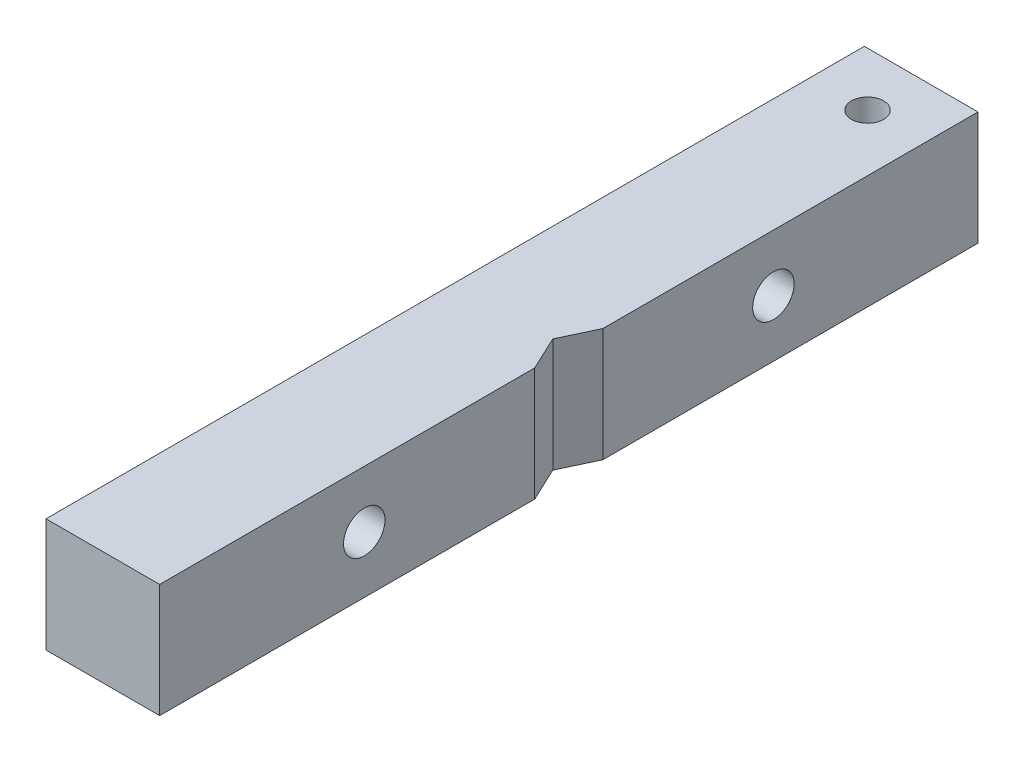
ISO-10303-21;
HEADER;
FILE_DESCRIPTION(('STEP AP214'),'2;1');
FILE_NAME('part.step','',(''),(''),'','','');
FILE_SCHEMA(('AUTOMOTIVE_DESIGN { 1 0 10303 214 1 1 1 1 }'));
ENDSEC;
DATA;
#1=APPLICATION_CONTEXT('core data for automotive mechanical design processes');
#2=APPLICATION_PROTOCOL_DEFINITION('international standard','automotive_design',2000,#1);
#3=PRODUCT_CONTEXT('',#1,'mechanical');
#4=PRODUCT('Part','Part','',(#3));
#5=PRODUCT_RELATED_PRODUCT_CATEGORY('part','',(#4));
#6=PRODUCT_DEFINITION_FORMATION('','',#4);
#7=PRODUCT_DEFINITION_CONTEXT('part definition',#1,'design');
#8=PRODUCT_DEFINITION('design','',#6,#7);
#9=PRODUCT_DEFINITION_SHAPE('','',#8);
#10=(LENGTH_UNIT() NAMED_UNIT(*) SI_UNIT(.MILLI.,.METRE.));
#11=(NAMED_UNIT(*) PLANE_ANGLE_UNIT() SI_UNIT($,.RADIAN.));
#12=(NAMED_UNIT(*) SI_UNIT($,.STERADIAN.) SOLID_ANGLE_UNIT());
#13=UNCERTAINTY_MEASURE_WITH_UNIT(LENGTH_MEASURE(1.E-05),#10,'distance_accuracy_value','');
#14=(GEOMETRIC_REPRESENTATION_CONTEXT(3) GLOBAL_UNCERTAINTY_ASSIGNED_CONTEXT((#13)) GLOBAL_UNIT_ASSIGNED_CONTEXT((#10,
#11,#12)) REPRESENTATION_CONTEXT('',''));
#15=CARTESIAN_POINT('',(0.,0.,0.));
#16=DIRECTION('',(0.,0.,1.));
#17=DIRECTION('',(1.,0.,0.));
#18=AXIS2_PLACEMENT_3D('',#15,#16,#17);
#19=CARTESIAN_POINT('',(7.9375,-7.9375,57.15));
#20=DIRECTION('',(-1.,0.,0.));
#21=DIRECTION('',(0.,0.,1.));
#22=AXIS2_PLACEMENT_3D('',#19,#20,#21);
#23=PLANE('',#22);
#24=DIRECTION('',(0.,-1.,0.));
#25=VECTOR('',#24,1.);
#26=CARTESIAN_POINT('',(7.9375,173.386244602263,4.7625));
#27=LINE('',#26,#25);
#28=CARTESIAN_POINT('',(7.9375,7.93749999999999,4.7625));
#29=VERTEX_POINT('',#28);
#30=CARTESIAN_POINT('',(7.9375,-7.9375,4.7625));
#31=VERTEX_POINT('',#30);
#32=EDGE_CURVE('E112',#29,#31,#27,.T.);
#33=ORIENTED_EDGE('',*,*,#32,.F.);
#34=DIRECTION('',(0.,0.,-1.));
#35=VECTOR('',#34,1.);
#36=CARTESIAN_POINT('',(7.9375,7.9375,57.15));
#37=LINE('',#36,#35);
#38=CARTESIAN_POINT('',(7.9375,7.9375,57.15));
#39=VERTEX_POINT('',#38);
#40=EDGE_CURVE('E99',#39,#29,#37,.T.);
#41=ORIENTED_EDGE('',*,*,#40,.F.);
#42=DIRECTION('',(0.,1.,0.));
#43=VECTOR('',#42,1.);
#44=CARTESIAN_POINT('',(7.9375,-7.9375,57.15));
#45=LINE('',#44,#43);
#46=CARTESIAN_POINT('',(7.9375,-7.9375,57.15));
#47=VERTEX_POINT('',#46);
#48=EDGE_CURVE('E153',#47,#39,#45,.T.);
#49=ORIENTED_EDGE('',*,*,#48,.F.);
#50=DIRECTION('',(0.,0.,-1.));
#51=VECTOR('',#50,1.);
#52=CARTESIAN_POINT('',(7.9375,-7.9375,57.15));
#53=LINE('',#52,#51);
#54=EDGE_CURVE('E115',#47,#31,#53,.T.);
#55=ORIENTED_EDGE('',*,*,#54,.T.);
#56=EDGE_LOOP('',(#33,#41,#49,#55));
#57=FACE_BOUND('',#56,.T.);
#58=CARTESIAN_POINT('',(7.9375,0.,28.575));
#59=DIRECTION('',(1.,0.,0.));
#60=DIRECTION('',(0.,0.,-1.));
#61=AXIS2_PLACEMENT_3D('',#58,#59,#60);
#62=CIRCLE('',#61,2.89559999999999);
#63=CARTESIAN_POINT('',(7.9375,0.,25.6794));
#64=VERTEX_POINT('',#63);
#65=EDGE_CURVE('E129',#64,#64,#62,.T.);
#66=ORIENTED_EDGE('',*,*,#65,.F.);
#67=EDGE_LOOP('',(#66));
#68=FACE_BOUND('',#67,.T.);
#69=ADVANCED_FACE('F37',(#57,#68),#23,.F.);
#70=CARTESIAN_POINT('',(7.9375,-7.9375,57.15));
#71=DIRECTION('',(0.,1.,0.));
#72=DIRECTION('',(-1.,0.,0.));
#73=AXIS2_PLACEMENT_3D('',#70,#71,#72);
#74=PLANE('',#73);
#75=CARTESIAN_POINT('',(0.,-7.9375,-49.6535819331427));
#76=DIRECTION('',(0.,-1.,0.));
#77=DIRECTION('',(0.,0.,-1.));
#78=AXIS2_PLACEMENT_3D('',#75,#76,#77);
#79=CIRCLE('',#78,2.24789999999999);
#80=CARTESIAN_POINT('',(0.,-7.9375,-51.9014819331427));
#81=VERTEX_POINT('',#80);
#82=EDGE_CURVE('E211',#81,#81,#79,.T.);
#83=ORIENTED_EDGE('',*,*,#82,.F.);
#84=EDGE_LOOP('',(#83));
#85=FACE_BOUND('',#84,.T.);
#86=DIRECTION('',(0.425234482200259,0.,-0.905083220012324));
#87=VECTOR('',#86,1.);
#88=CARTESIAN_POINT('',(-15.8909245014143,-7.9375,45.954711511093));
#89=LINE('',#88,#87);
#90=CARTESIAN_POINT('',(5.69993866121929,-7.9375,0.));
#91=VERTEX_POINT('',#90);
#92=CARTESIAN_POINT('',(7.9375,-7.9375,-4.7625));
#93=VERTEX_POINT('',#92);
#94=EDGE_CURVE('E54',#91,#93,#89,.T.);
#95=ORIENTED_EDGE('',*,*,#94,.F.);
#96=DIRECTION('',(-0.425234482200259,0.,-0.905083220012324));
#97=VECTOR('',#96,1.);
#98=CARTESIAN_POINT('',(28.1000130396583,-7.9375,47.6770635863094));
#99=LINE('',#98,#97);
#100=EDGE_CURVE('E143',#31,#91,#99,.T.);
#101=ORIENTED_EDGE('',*,*,#100,.F.);
#102=ORIENTED_EDGE('',*,*,#54,.F.);
#103=DIRECTION('',(1.,0.,0.));
#104=VECTOR('',#103,1.);
#105=CARTESIAN_POINT('',(7.9375,-7.9375,57.15));
#106=LINE('',#105,#104);
#107=CARTESIAN_POINT('',(-7.9375,-7.9375,57.15));
#108=VERTEX_POINT('',#107);
#109=EDGE_CURVE('E150',#108,#47,#106,.T.);
#110=ORIENTED_EDGE('',*,*,#109,.F.);
#111=DIRECTION('',(0.,0.,-1.));
#112=VECTOR('',#111,1.);
#113=CARTESIAN_POINT('',(-7.9375,-7.9375,57.15));
#114=LINE('',#113,#112);
#115=CARTESIAN_POINT('',(-7.9375,-7.9375,-57.15));
#116=VERTEX_POINT('',#115);
#117=EDGE_CURVE('E122',#108,#116,#114,.T.);
#118=ORIENTED_EDGE('',*,*,#117,.T.);
#119=DIRECTION('',(1.,0.,0.));
#120=VECTOR('',#119,1.);
#121=CARTESIAN_POINT('',(7.9375,-7.9375,-57.15));
#122=LINE('',#121,#120);
#123=CARTESIAN_POINT('',(7.9375,-7.9375,-57.15));
#124=VERTEX_POINT('',#123);
#125=EDGE_CURVE('E159',#116,#124,#122,.T.);
#126=ORIENTED_EDGE('',*,*,#125,.T.);
#127=EDGE_CURVE('E107',#93,#124,#53,.T.);
#128=ORIENTED_EDGE('',*,*,#127,.F.);
#129=EDGE_LOOP('',(#95,#101,#102,#110,#118,#126,#128));
#130=FACE_BOUND('',#129,.T.);
#131=ADVANCED_FACE('F170',(#85,#130),#74,.F.);
#132=CARTESIAN_POINT('',(7.9375,0.,-28.575));
#133=DIRECTION('',(1.,0.,0.));
#134=DIRECTION('',(0.,0.,-1.));
#135=AXIS2_PLACEMENT_3D('',#132,#133,#134);
#136=CIRCLE('',#135,2.89559999999999);
#137=CARTESIAN_POINT('',(7.9375,0.,-31.4706));
#138=VERTEX_POINT('',#137);
#139=EDGE_CURVE('E138',#138,#138,#136,.T.);
#140=ORIENTED_EDGE('',*,*,#139,.F.);
#141=EDGE_LOOP('',(#140));
#142=FACE_BOUND('',#141,.T.);
#143=DIRECTION('',(0.,-1.,0.));
#144=VECTOR('',#143,1.);
#145=CARTESIAN_POINT('',(7.9375,173.386244602263,-4.7625));
#146=LINE('',#145,#144);
#147=CARTESIAN_POINT('',(7.9375,7.9375,-4.76249999999999));
#148=VERTEX_POINT('',#147);
#149=EDGE_CURVE('E62',#148,#93,#146,.T.);
#150=ORIENTED_EDGE('',*,*,#149,.T.);
#151=ORIENTED_EDGE('',*,*,#127,.T.);
#152=DIRECTION('',(0.,1.,0.));
#153=VECTOR('',#152,1.);
#154=CARTESIAN_POINT('',(7.9375,-7.9375,-57.15));
#155=LINE('',#154,#153);
#156=CARTESIAN_POINT('',(7.9375,7.9375,-57.15));
#157=VERTEX_POINT('',#156);
#158=EDGE_CURVE('E162',#124,#157,#155,.T.);
#159=ORIENTED_EDGE('',*,*,#158,.T.);
#160=EDGE_CURVE('E108',#148,#157,#37,.T.);
#161=ORIENTED_EDGE('',*,*,#160,.F.);
#162=EDGE_LOOP('',(#150,#151,#159,#161));
#163=FACE_BOUND('',#162,.T.);
#164=ADVANCED_FACE('F167',(#142,#163),#23,.F.);
#165=CARTESIAN_POINT('',(7.9375,7.9375,57.15));
#166=DIRECTION('',(0.,-1.,0.));
#167=DIRECTION('',(0.,0.,-1.));
#168=AXIS2_PLACEMENT_3D('',#165,#166,#167);
#169=PLANE('',#168);
#170=CARTESIAN_POINT('',(0.,7.9375,-49.6535819331427));
#171=DIRECTION('',(0.,-1.,0.));
#172=DIRECTION('',(0.,0.,-1.));
#173=AXIS2_PLACEMENT_3D('',#170,#171,#172);
#174=CIRCLE('',#173,2.24789999999999);
#175=CARTESIAN_POINT('',(0.,7.9375,-51.9014819331427));
#176=VERTEX_POINT('',#175);
#177=EDGE_CURVE('E209',#176,#176,#174,.T.);
#178=ORIENTED_EDGE('',*,*,#177,.T.);
#179=EDGE_LOOP('',(#178));
#180=FACE_BOUND('',#179,.T.);
#181=DIRECTION('',(-0.425234482200259,0.,0.905083220012324));
#182=VECTOR('',#181,1.);
#183=CARTESIAN_POINT('',(-15.8909245014143,7.9375,45.954711511093));
#184=LINE('',#183,#182);
#185=CARTESIAN_POINT('',(5.69993866121929,7.9375,0.));
#186=VERTEX_POINT('',#185);
#187=EDGE_CURVE('E11',#148,#186,#184,.T.);
#188=ORIENTED_EDGE('',*,*,#187,.F.);
#189=ORIENTED_EDGE('',*,*,#160,.T.);
#190=DIRECTION('',(-1.,0.,0.));
#191=VECTOR('',#190,1.);
#192=CARTESIAN_POINT('',(7.9375,7.9375,-57.15));
#193=LINE('',#192,#191);
#194=CARTESIAN_POINT('',(-7.9375,7.9375,-57.15));
#195=VERTEX_POINT('',#194);
#196=EDGE_CURVE('E151',#157,#195,#193,.T.);
#197=ORIENTED_EDGE('',*,*,#196,.T.);
#198=DIRECTION('',(0.,0.,-1.));
#199=VECTOR('',#198,1.);
#200=CARTESIAN_POINT('',(-7.9375,7.9375,57.15));
#201=LINE('',#200,#199);
#202=CARTESIAN_POINT('',(-7.9375,7.9375,57.15));
#203=VERTEX_POINT('',#202);
#204=EDGE_CURVE('E156',#203,#195,#201,.T.);
#205=ORIENTED_EDGE('',*,*,#204,.F.);
#206=DIRECTION('',(-1.,0.,0.));
#207=VECTOR('',#206,1.);
#208=CARTESIAN_POINT('',(7.9375,7.9375,57.15));
#209=LINE('',#208,#207);
#210=EDGE_CURVE('E104',#39,#203,#209,.T.);
#211=ORIENTED_EDGE('',*,*,#210,.F.);
#212=ORIENTED_EDGE('',*,*,#40,.T.);
#213=DIRECTION('',(0.425234482200259,0.,0.905083220012324));
#214=VECTOR('',#213,1.);
#215=CARTESIAN_POINT('',(28.1000130396583,7.9375,47.6770635863094));
#216=LINE('',#215,#214);
#217=EDGE_CURVE('E46',#186,#29,#216,.T.);
#218=ORIENTED_EDGE('',*,*,#217,.F.);
#219=EDGE_LOOP('',(#188,#189,#197,#205,#211,#212,#218));
#220=FACE_BOUND('',#219,.T.);
#221=ADVANCED_FACE('F101',(#180,#220),#169,.F.);
#222=CARTESIAN_POINT('',(-7.9375,-7.9375,57.15));
#223=DIRECTION('',(1.,0.,0.));
#224=DIRECTION('',(0.,0.,-1.));
#225=AXIS2_PLACEMENT_3D('',#222,#223,#224);
#226=PLANE('',#225);
#227=CARTESIAN_POINT('',(-7.9375,0.,-28.575));
#228=DIRECTION('',(1.,0.,0.));
#229=DIRECTION('',(0.,0.,-1.));
#230=AXIS2_PLACEMENT_3D('',#227,#228,#229);
#231=CIRCLE('',#230,2.89559999999999);
#232=CARTESIAN_POINT('',(-7.9375,0.,-31.4706));
#233=VERTEX_POINT('',#232);
#234=EDGE_CURVE('E41',#233,#233,#231,.T.);
#235=ORIENTED_EDGE('',*,*,#234,.T.);
#236=EDGE_LOOP('',(#235));
#237=FACE_BOUND('',#236,.T.);
#238=CARTESIAN_POINT('',(-7.9375,0.,28.575));
#239=DIRECTION('',(1.,0.,0.));
#240=DIRECTION('',(0.,0.,-1.));
#241=AXIS2_PLACEMENT_3D('',#238,#239,#240);
#242=CIRCLE('',#241,2.89559999999999);
#243=CARTESIAN_POINT('',(-7.9375,0.,25.6794));
#244=VERTEX_POINT('',#243);
#245=EDGE_CURVE('E127',#244,#244,#242,.T.);
#246=ORIENTED_EDGE('',*,*,#245,.T.);
#247=EDGE_LOOP('',(#246));
#248=FACE_BOUND('',#247,.T.);
#249=DIRECTION('',(0.,-1.,0.));
#250=VECTOR('',#249,1.);
#251=CARTESIAN_POINT('',(-7.9375,-7.9375,-57.15));
#252=LINE('',#251,#250);
#253=EDGE_CURVE('E146',#195,#116,#252,.T.);
#254=ORIENTED_EDGE('',*,*,#253,.T.);
#255=ORIENTED_EDGE('',*,*,#117,.F.);
#256=DIRECTION('',(0.,-1.,0.));
#257=VECTOR('',#256,1.);
#258=CARTESIAN_POINT('',(-7.9375,-7.9375,57.15));
#259=LINE('',#258,#257);
#260=EDGE_CURVE('E147',#203,#108,#259,.T.);
#261=ORIENTED_EDGE('',*,*,#260,.F.);
#262=ORIENTED_EDGE('',*,*,#204,.T.);
#263=EDGE_LOOP('',(#254,#255,#261,#262));
#264=FACE_BOUND('',#263,.T.);
#265=ADVANCED_FACE('F39',(#237,#248,#264),#226,.F.);
#266=CARTESIAN_POINT('',(0.,0.,57.15));
#267=DIRECTION('',(0.,0.,1.));
#268=DIRECTION('',(1.,0.,0.));
#269=AXIS2_PLACEMENT_3D('',#266,#267,#268);
#270=PLANE('',#269);
#271=ORIENTED_EDGE('',*,*,#260,.T.);
#272=ORIENTED_EDGE('',*,*,#109,.T.);
#273=ORIENTED_EDGE('',*,*,#48,.T.);
#274=ORIENTED_EDGE('',*,*,#210,.T.);
#275=EDGE_LOOP('',(#271,#272,#273,#274));
#276=FACE_BOUND('',#275,.T.);
#277=ADVANCED_FACE('F178',(#276),#270,.T.);
#278=CARTESIAN_POINT('',(0.,0.,-57.15));
#279=DIRECTION('',(0.,0.,1.));
#280=DIRECTION('',(1.,0.,0.));
#281=AXIS2_PLACEMENT_3D('',#278,#279,#280);
#282=PLANE('',#281);
#283=ORIENTED_EDGE('',*,*,#253,.F.);
#284=ORIENTED_EDGE('',*,*,#196,.F.);
#285=ORIENTED_EDGE('',*,*,#158,.F.);
#286=ORIENTED_EDGE('',*,*,#125,.F.);
#287=EDGE_LOOP('',(#283,#284,#285,#286));
#288=FACE_BOUND('',#287,.T.);
#289=ADVANCED_FACE('F174',(#288),#282,.F.);
#290=CARTESIAN_POINT('',(7.9375,173.386244602263,-4.7625));
#291=DIRECTION('',(0.905083220012324,0.,0.425234482200259));
#292=DIRECTION('',(0.425234482200259,0.,-0.905083220012324));
#293=AXIS2_PLACEMENT_3D('',#290,#291,#292);
#294=PLANE('',#293);
#295=DIRECTION('',(0.,-1.,0.));
#296=VECTOR('',#295,1.);
#297=CARTESIAN_POINT('',(5.69993866121929,173.386244602263,0.));
#298=LINE('',#297,#296);
#299=EDGE_CURVE('E117',#186,#91,#298,.T.);
#300=ORIENTED_EDGE('',*,*,#299,.T.);
#301=ORIENTED_EDGE('',*,*,#94,.T.);
#302=ORIENTED_EDGE('',*,*,#149,.F.);
#303=ORIENTED_EDGE('',*,*,#187,.T.);
#304=EDGE_LOOP('',(#300,#301,#302,#303));
#305=FACE_BOUND('',#304,.T.);
#306=ADVANCED_FACE('F180',(#305),#294,.T.);
#307=CARTESIAN_POINT('',(5.69993866121929,173.386244602263,0.));
#308=DIRECTION('',(0.905083220012324,0.,-0.425234482200259));
#309=DIRECTION('',(-0.425234482200259,0.,-0.905083220012324));
#310=AXIS2_PLACEMENT_3D('',#307,#308,#309);
#311=PLANE('',#310);
#312=ORIENTED_EDGE('',*,*,#32,.T.);
#313=ORIENTED_EDGE('',*,*,#100,.T.);
#314=ORIENTED_EDGE('',*,*,#299,.F.);
#315=ORIENTED_EDGE('',*,*,#217,.T.);
#316=EDGE_LOOP('',(#312,#313,#314,#315));
#317=FACE_BOUND('',#316,.T.);
#318=ADVANCED_FACE('F120',(#317),#311,.T.);
#319=CARTESIAN_POINT('',(7.9375,0.,28.575));
#320=DIRECTION('',(1.,0.,0.));
#321=DIRECTION('',(0.,0.,-1.));
#322=AXIS2_PLACEMENT_3D('',#319,#320,#321);
#323=CYLINDRICAL_SURFACE('',#322,2.89559999999999);
#324=ORIENTED_EDGE('',*,*,#65,.T.);
#325=EDGE_LOOP('',(#324));
#326=FACE_BOUND('',#325,.T.);
#327=ORIENTED_EDGE('',*,*,#245,.F.);
#328=EDGE_LOOP('',(#327));
#329=FACE_BOUND('',#328,.T.);
#330=ADVANCED_FACE('F187',(#326,#329),#323,.F.);
#331=CARTESIAN_POINT('',(7.9375,0.,-28.575));
#332=DIRECTION('',(1.,0.,0.));
#333=DIRECTION('',(0.,0.,-1.));
#334=AXIS2_PLACEMENT_3D('',#331,#332,#333);
#335=CYLINDRICAL_SURFACE('',#334,2.89559999999999);
#336=ORIENTED_EDGE('',*,*,#139,.T.);
#337=EDGE_LOOP('',(#336));
#338=FACE_BOUND('',#337,.T.);
#339=ORIENTED_EDGE('',*,*,#234,.F.);
#340=EDGE_LOOP('',(#339));
#341=FACE_BOUND('',#340,.T.);
#342=ADVANCED_FACE('F219',(#338,#341),#335,.F.);
#343=CARTESIAN_POINT('',(0.,-7.9375,-49.6535819331427));
#344=DIRECTION('',(0.,-1.,0.));
#345=DIRECTION('',(0.,0.,-1.));
#346=AXIS2_PLACEMENT_3D('',#343,#344,#345);
#347=CYLINDRICAL_SURFACE('',#346,2.24789999999999);
#348=ORIENTED_EDGE('',*,*,#177,.F.);
#349=EDGE_LOOP('',(#348));
#350=FACE_BOUND('',#349,.T.);
#351=ORIENTED_EDGE('',*,*,#82,.T.);
#352=EDGE_LOOP('',(#351));
#353=FACE_BOUND('',#352,.T.);
#354=ADVANCED_FACE('F217',(#350,#353),#347,.F.);
#355=CLOSED_SHELL('',(#69,#131,#164,#221,#265,#277,#289,#306,#318,#330,#342,#354));
#356=MANIFOLD_SOLID_BREP('B2',#355);
#357=ADVANCED_BREP_SHAPE_REPRESENTATION('',(#18,#356),#14);
#358=SHAPE_DEFINITION_REPRESENTATION(#9,#357);
ENDSEC;
END-ISO-10303-21;
